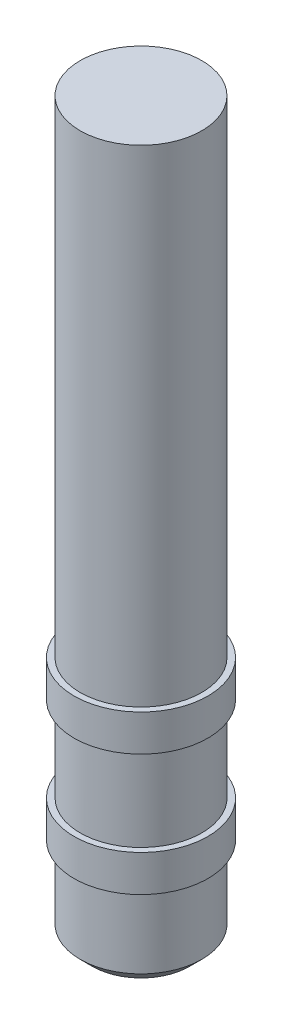
ISO-10303-21;
HEADER;
FILE_DESCRIPTION(('STEP AP214'),'2;1');
FILE_NAME('part.step','',(''),(''),'','','');
FILE_SCHEMA(('AUTOMOTIVE_DESIGN { 1 0 10303 214 1 1 1 1 }'));
ENDSEC;
DATA;
#1=APPLICATION_CONTEXT('core data for automotive mechanical design processes');
#2=APPLICATION_PROTOCOL_DEFINITION('international standard','automotive_design',2000,#1);
#3=PRODUCT_CONTEXT('',#1,'mechanical');
#4=PRODUCT('Part','Part','',(#3));
#5=PRODUCT_RELATED_PRODUCT_CATEGORY('part','',(#4));
#6=PRODUCT_DEFINITION_FORMATION('','',#4);
#7=PRODUCT_DEFINITION_CONTEXT('part definition',#1,'design');
#8=PRODUCT_DEFINITION('design','',#6,#7);
#9=PRODUCT_DEFINITION_SHAPE('','',#8);
#10=(LENGTH_UNIT() NAMED_UNIT(*) SI_UNIT(.MILLI.,.METRE.));
#11=(NAMED_UNIT(*) PLANE_ANGLE_UNIT() SI_UNIT($,.RADIAN.));
#12=(NAMED_UNIT(*) SI_UNIT($,.STERADIAN.) SOLID_ANGLE_UNIT());
#13=UNCERTAINTY_MEASURE_WITH_UNIT(LENGTH_MEASURE(1.E-05),#10,'distance_accuracy_value','');
#14=(GEOMETRIC_REPRESENTATION_CONTEXT(3) GLOBAL_UNCERTAINTY_ASSIGNED_CONTEXT((#13)) GLOBAL_UNIT_ASSIGNED_CONTEXT((#10,
#11,#12)) REPRESENTATION_CONTEXT('',''));
#15=CARTESIAN_POINT('',(0.,0.,0.));
#16=DIRECTION('',(0.,0.,1.));
#17=DIRECTION('',(1.,0.,0.));
#18=AXIS2_PLACEMENT_3D('',#15,#16,#17);
#19=CARTESIAN_POINT('',(0.,60.,0.));
#20=DIRECTION('',(0.,-1.,0.));
#21=DIRECTION('',(0.,0.,-1.));
#22=AXIS2_PLACEMENT_3D('',#19,#20,#21);
#23=CYLINDRICAL_SURFACE('',#22,5.);
#24=CARTESIAN_POINT('',(0.,17.,0.));
#25=DIRECTION('',(0.,1.,0.));
#26=DIRECTION('',(0.,0.,1.));
#27=AXIS2_PLACEMENT_3D('',#24,#25,#26);
#28=CIRCLE('',#27,5.);
#29=CARTESIAN_POINT('',(0.,17.,5.));
#30=VERTEX_POINT('',#29);
#31=EDGE_CURVE('E60',#30,#30,#28,.T.);
#32=ORIENTED_EDGE('',*,*,#31,.F.);
#33=EDGE_LOOP('',(#32));
#34=FACE_BOUND('',#33,.T.);
#35=CARTESIAN_POINT('',(0.,10.,0.));
#36=DIRECTION('',(0.,-1.,0.));
#37=DIRECTION('',(0.,0.,-1.));
#38=AXIS2_PLACEMENT_3D('',#35,#36,#37);
#39=CIRCLE('',#38,5.);
#40=CARTESIAN_POINT('',(0.,10.,-5.));
#41=VERTEX_POINT('',#40);
#42=EDGE_CURVE('E10',#41,#41,#39,.T.);
#43=ORIENTED_EDGE('',*,*,#42,.F.);
#44=EDGE_LOOP('',(#43));
#45=FACE_BOUND('',#44,.T.);
#46=ADVANCED_FACE('F39',(#34,#45),#23,.T.);
#47=CARTESIAN_POINT('',(0.,20.,0.));
#48=DIRECTION('',(0.,1.,0.));
#49=DIRECTION('',(0.,0.,1.));
#50=AXIS2_PLACEMENT_3D('',#47,#48,#49);
#51=CIRCLE('',#50,5.);
#52=CARTESIAN_POINT('',(0.,20.,5.));
#53=VERTEX_POINT('',#52);
#54=EDGE_CURVE('E61',#53,#53,#51,.T.);
#55=ORIENTED_EDGE('',*,*,#54,.T.);
#56=EDGE_LOOP('',(#55));
#57=FACE_BOUND('',#56,.T.);
#58=CARTESIAN_POINT('',(0.,60.,0.));
#59=DIRECTION('',(0.,1.,0.));
#60=DIRECTION('',(0.,0.,1.));
#61=AXIS2_PLACEMENT_3D('',#58,#59,#60);
#62=CIRCLE('',#61,5.);
#63=CARTESIAN_POINT('',(0.,60.,5.));
#64=VERTEX_POINT('',#63);
#65=EDGE_CURVE('E65',#64,#64,#62,.T.);
#66=ORIENTED_EDGE('',*,*,#65,.F.);
#67=EDGE_LOOP('',(#66));
#68=FACE_BOUND('',#67,.T.);
#69=ADVANCED_FACE('F111',(#57,#68),#23,.T.);
#70=CARTESIAN_POINT('',(0.,60.,0.));
#71=DIRECTION('',(0.,1.,0.));
#72=DIRECTION('',(0.,0.,1.));
#73=AXIS2_PLACEMENT_3D('',#70,#71,#72);
#74=PLANE('',#73);
#75=ORIENTED_EDGE('',*,*,#65,.T.);
#76=EDGE_LOOP('',(#75));
#77=FACE_BOUND('',#76,.T.);
#78=ADVANCED_FACE('F116',(#77),#74,.T.);
#79=CARTESIAN_POINT('',(0.,20.,0.));
#80=DIRECTION('',(0.,-1.,0.));
#81=DIRECTION('',(0.,0.,-1.));
#82=AXIS2_PLACEMENT_3D('',#79,#80,#81);
#83=CYLINDRICAL_SURFACE('',#82,5.5);
#84=CARTESIAN_POINT('',(0.,20.,0.));
#85=DIRECTION('',(0.,1.,0.));
#86=DIRECTION('',(0.,0.,1.));
#87=AXIS2_PLACEMENT_3D('',#84,#85,#86);
#88=CIRCLE('',#87,5.5);
#89=CARTESIAN_POINT('',(0.,20.,5.5));
#90=VERTEX_POINT('',#89);
#91=EDGE_CURVE('E66',#90,#90,#88,.T.);
#92=ORIENTED_EDGE('',*,*,#91,.F.);
#93=EDGE_LOOP('',(#92));
#94=FACE_BOUND('',#93,.T.);
#95=CARTESIAN_POINT('',(0.,17.,0.));
#96=DIRECTION('',(0.,1.,0.));
#97=DIRECTION('',(0.,0.,1.));
#98=AXIS2_PLACEMENT_3D('',#95,#96,#97);
#99=CIRCLE('',#98,5.5);
#100=CARTESIAN_POINT('',(0.,17.,5.5));
#101=VERTEX_POINT('',#100);
#102=EDGE_CURVE('E73',#101,#101,#99,.T.);
#103=ORIENTED_EDGE('',*,*,#102,.T.);
#104=EDGE_LOOP('',(#103));
#105=FACE_BOUND('',#104,.T.);
#106=ADVANCED_FACE('F138',(#94,#105),#83,.T.);
#107=CARTESIAN_POINT('',(0.,20.,0.));
#108=DIRECTION('',(0.,1.,0.));
#109=DIRECTION('',(0.,0.,1.));
#110=AXIS2_PLACEMENT_3D('',#107,#108,#109);
#111=PLANE('',#110);
#112=ORIENTED_EDGE('',*,*,#54,.F.);
#113=EDGE_LOOP('',(#112));
#114=FACE_BOUND('',#113,.T.);
#115=ORIENTED_EDGE('',*,*,#91,.T.);
#116=EDGE_LOOP('',(#115));
#117=FACE_BOUND('',#116,.T.);
#118=ADVANCED_FACE('F142',(#114,#117),#111,.T.);
#119=CARTESIAN_POINT('',(0.,17.,0.));
#120=DIRECTION('',(0.,1.,0.));
#121=DIRECTION('',(0.,0.,1.));
#122=AXIS2_PLACEMENT_3D('',#119,#120,#121);
#123=PLANE('',#122);
#124=ORIENTED_EDGE('',*,*,#31,.T.);
#125=EDGE_LOOP('',(#124));
#126=FACE_BOUND('',#125,.T.);
#127=ORIENTED_EDGE('',*,*,#102,.F.);
#128=EDGE_LOOP('',(#127));
#129=FACE_BOUND('',#128,.T.);
#130=ADVANCED_FACE('F107',(#126,#129),#123,.F.);
#131=CARTESIAN_POINT('',(0.,7.,0.));
#132=DIRECTION('',(0.,1.,0.));
#133=DIRECTION('',(0.,0.,1.));
#134=AXIS2_PLACEMENT_3D('',#131,#132,#133);
#135=CYLINDRICAL_SURFACE('',#134,5.5);
#136=CARTESIAN_POINT('',(0.,7.,0.));
#137=DIRECTION('',(0.,-1.,0.));
#138=DIRECTION('',(0.,0.,-1.));
#139=AXIS2_PLACEMENT_3D('',#136,#137,#138);
#140=CIRCLE('',#139,5.5);
#141=CARTESIAN_POINT('',(0.,7.,-5.5));
#142=VERTEX_POINT('',#141);
#143=EDGE_CURVE('E84',#142,#142,#140,.T.);
#144=ORIENTED_EDGE('',*,*,#143,.F.);
#145=EDGE_LOOP('',(#144));
#146=FACE_BOUND('',#145,.T.);
#147=CARTESIAN_POINT('',(0.,10.,0.));
#148=DIRECTION('',(0.,-1.,0.));
#149=DIRECTION('',(0.,0.,-1.));
#150=AXIS2_PLACEMENT_3D('',#147,#148,#149);
#151=CIRCLE('',#150,5.5);
#152=CARTESIAN_POINT('',(0.,10.,-5.5));
#153=VERTEX_POINT('',#152);
#154=EDGE_CURVE('E80',#153,#153,#151,.T.);
#155=ORIENTED_EDGE('',*,*,#154,.T.);
#156=EDGE_LOOP('',(#155));
#157=FACE_BOUND('',#156,.T.);
#158=ADVANCED_FACE('F99',(#146,#157),#135,.T.);
#159=CARTESIAN_POINT('',(0.,7.,0.));
#160=DIRECTION('',(0.,-1.,0.));
#161=DIRECTION('',(0.,0.,-1.));
#162=AXIS2_PLACEMENT_3D('',#159,#160,#161);
#163=PLANE('',#162);
#164=CARTESIAN_POINT('',(0.,7.,0.));
#165=DIRECTION('',(0.,-1.,0.));
#166=DIRECTION('',(0.,0.,-1.));
#167=AXIS2_PLACEMENT_3D('',#164,#165,#166);
#168=CIRCLE('',#167,5.);
#169=CARTESIAN_POINT('',(0.,7.,-5.));
#170=VERTEX_POINT('',#169);
#171=EDGE_CURVE('E44',#170,#170,#168,.T.);
#172=ORIENTED_EDGE('',*,*,#171,.F.);
#173=EDGE_LOOP('',(#172));
#174=FACE_BOUND('',#173,.T.);
#175=ORIENTED_EDGE('',*,*,#143,.T.);
#176=EDGE_LOOP('',(#175));
#177=FACE_BOUND('',#176,.T.);
#178=ADVANCED_FACE('F96',(#174,#177),#163,.T.);
#179=CARTESIAN_POINT('',(0.,10.,0.));
#180=DIRECTION('',(0.,-1.,0.));
#181=DIRECTION('',(0.,0.,-1.));
#182=AXIS2_PLACEMENT_3D('',#179,#180,#181);
#183=PLANE('',#182);
#184=ORIENTED_EDGE('',*,*,#42,.T.);
#185=EDGE_LOOP('',(#184));
#186=FACE_BOUND('',#185,.T.);
#187=ORIENTED_EDGE('',*,*,#154,.F.);
#188=EDGE_LOOP('',(#187));
#189=FACE_BOUND('',#188,.T.);
#190=ADVANCED_FACE('F98',(#186,#189),#183,.F.);
#191=CARTESIAN_POINT('',(0.,0.,0.));
#192=DIRECTION('',(0.,1.,0.));
#193=DIRECTION('',(0.,0.,1.));
#194=AXIS2_PLACEMENT_3D('',#191,#192,#193);
#195=PLANE('',#194);
#196=CARTESIAN_POINT('',(0.,0.,0.));
#197=DIRECTION('',(0.,1.,0.));
#198=DIRECTION('',(0.,0.,1.));
#199=AXIS2_PLACEMENT_3D('',#196,#197,#198);
#200=CIRCLE('',#199,4.);
#201=CARTESIAN_POINT('',(0.,0.,4.));
#202=VERTEX_POINT('',#201);
#203=EDGE_CURVE('E49',#202,#202,#200,.F.);
#204=ORIENTED_EDGE('',*,*,#203,.T.);
#205=EDGE_LOOP('',(#204));
#206=FACE_BOUND('',#205,.T.);
#207=ADVANCED_FACE('F105',(#206),#195,.F.);
#208=CARTESIAN_POINT('',(0.,1.,0.));
#209=DIRECTION('',(0.,1.,0.));
#210=DIRECTION('',(0.,0.,1.));
#211=AXIS2_PLACEMENT_3D('',#208,#209,#210);
#212=CONICAL_SURFACE('',#211,5.,0.785398163397446);
#213=ORIENTED_EDGE('',*,*,#203,.F.);
#214=EDGE_LOOP('',(#213));
#215=FACE_BOUND('',#214,.T.);
#216=CARTESIAN_POINT('',(0.,1.,0.));
#217=DIRECTION('',(0.,1.,0.));
#218=DIRECTION('',(0.,0.,1.));
#219=AXIS2_PLACEMENT_3D('',#216,#217,#218);
#220=CIRCLE('',#219,5.);
#221=CARTESIAN_POINT('',(0.,1.,5.));
#222=VERTEX_POINT('',#221);
#223=EDGE_CURVE('E54',#222,#222,#220,.T.);
#224=ORIENTED_EDGE('',*,*,#223,.F.);
#225=EDGE_LOOP('',(#224));
#226=FACE_BOUND('',#225,.T.);
#227=ADVANCED_FACE('F42',(#215,#226),#212,.T.);
#228=ORIENTED_EDGE('',*,*,#171,.T.);
#229=EDGE_LOOP('',(#228));
#230=FACE_BOUND('',#229,.T.);
#231=ORIENTED_EDGE('',*,*,#223,.T.);
#232=EDGE_LOOP('',(#231));
#233=FACE_BOUND('',#232,.T.);
#234=ADVANCED_FACE('F93',(#230,#233),#23,.T.);
#235=CLOSED_SHELL('',(#46,#69,#78,#106,#118,#130,#158,#178,#190,#207,#227,#234));
#236=MANIFOLD_SOLID_BREP('B2',#235);
#237=ADVANCED_BREP_SHAPE_REPRESENTATION('',(#18,#236),#14);
#238=SHAPE_DEFINITION_REPRESENTATION(#9,#237);
ENDSEC;
END-ISO-10303-21;
